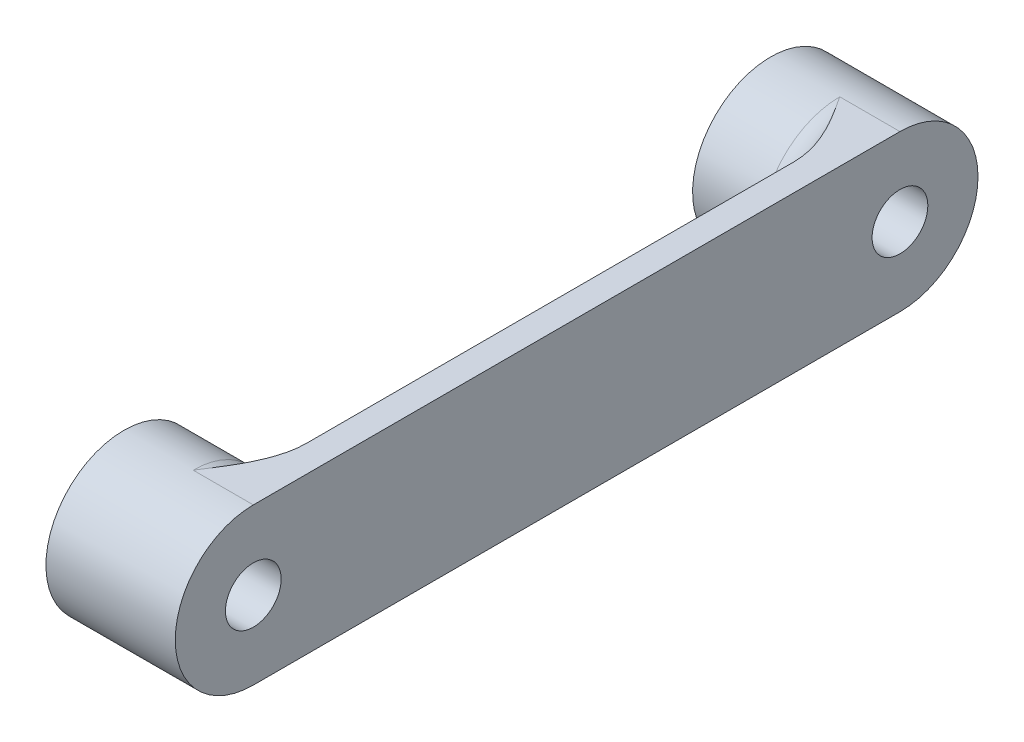
ISO-10303-21;
HEADER;
FILE_DESCRIPTION(('STEP AP214'),'2;1');
FILE_NAME('part.step','',(''),(''),'','','');
FILE_SCHEMA(('AUTOMOTIVE_DESIGN { 1 0 10303 214 1 1 1 1 }'));
ENDSEC;
DATA;
#1=APPLICATION_CONTEXT('core data for automotive mechanical design processes');
#2=APPLICATION_PROTOCOL_DEFINITION('international standard','automotive_design',2000,#1);
#3=PRODUCT_CONTEXT('',#1,'mechanical');
#4=PRODUCT('Part','Part','',(#3));
#5=PRODUCT_RELATED_PRODUCT_CATEGORY('part','',(#4));
#6=PRODUCT_DEFINITION_FORMATION('','',#4);
#7=PRODUCT_DEFINITION_CONTEXT('part definition',#1,'design');
#8=PRODUCT_DEFINITION('design','',#6,#7);
#9=PRODUCT_DEFINITION_SHAPE('','',#8);
#10=(LENGTH_UNIT() NAMED_UNIT(*) SI_UNIT(.MILLI.,.METRE.));
#11=(NAMED_UNIT(*) PLANE_ANGLE_UNIT() SI_UNIT($,.RADIAN.));
#12=(NAMED_UNIT(*) SI_UNIT($,.STERADIAN.) SOLID_ANGLE_UNIT());
#13=UNCERTAINTY_MEASURE_WITH_UNIT(LENGTH_MEASURE(1.E-05),#10,'distance_accuracy_value','');
#14=(GEOMETRIC_REPRESENTATION_CONTEXT(3) GLOBAL_UNCERTAINTY_ASSIGNED_CONTEXT((#13)) GLOBAL_UNIT_ASSIGNED_CONTEXT((#10,
#11,#12)) REPRESENTATION_CONTEXT('',''));
#15=CARTESIAN_POINT('',(0.,0.,0.));
#16=DIRECTION('',(0.,0.,1.));
#17=DIRECTION('',(1.,0.,0.));
#18=AXIS2_PLACEMENT_3D('',#15,#16,#17);
#19=CARTESIAN_POINT('',(9.2,0.,0.));
#20=DIRECTION('',(1.,0.,0.));
#21=DIRECTION('',(0.,0.,-1.));
#22=AXIS2_PLACEMENT_3D('',#19,#20,#21);
#23=PLANE('',#22);
#24=DIRECTION('',(0.,0.,1.));
#25=VECTOR('',#24,1.);
#26=CARTESIAN_POINT('',(9.2,-7.,0.));
#27=LINE('',#26,#25);
#28=CARTESIAN_POINT('',(9.2,-6.99999999999999,-21.8585715714571));
#29=VERTEX_POINT('',#28);
#30=CARTESIAN_POINT('',(9.2,-7.,21.8585715714572));
#31=VERTEX_POINT('',#30);
#32=EDGE_CURVE('E133',#29,#31,#27,.T.);
#33=ORIENTED_EDGE('',*,*,#32,.T.);
#34=CARTESIAN_POINT('',(9.2,0.,29.));
#35=DIRECTION('',(1.,0.,0.));
#36=DIRECTION('',(0.,0.,-1.));
#37=AXIS2_PLACEMENT_3D('',#34,#35,#36);
#38=CIRCLE('',#37,10.);
#39=CARTESIAN_POINT('',(9.2,7.,21.8585715714572));
#40=VERTEX_POINT('',#39);
#41=EDGE_CURVE('E151',#31,#40,#38,.T.);
#42=ORIENTED_EDGE('',*,*,#41,.T.);
#43=DIRECTION('',(0.,0.,-1.));
#44=VECTOR('',#43,1.);
#45=CARTESIAN_POINT('',(9.2,7.00000000000001,0.));
#46=LINE('',#45,#44);
#47=CARTESIAN_POINT('',(9.2,7.00000000000001,-21.8585715714571));
#48=VERTEX_POINT('',#47);
#49=EDGE_CURVE('E136',#40,#48,#46,.T.);
#50=ORIENTED_EDGE('',*,*,#49,.T.);
#51=CARTESIAN_POINT('',(9.2,0.,-29.));
#52=DIRECTION('',(1.,0.,0.));
#53=DIRECTION('',(0.,0.,-1.));
#54=AXIS2_PLACEMENT_3D('',#51,#52,#53);
#55=CIRCLE('',#54,10.);
#56=EDGE_CURVE('E148',#48,#29,#55,.T.);
#57=ORIENTED_EDGE('',*,*,#56,.T.);
#58=EDGE_LOOP('',(#33,#42,#50,#57));
#59=FACE_BOUND('',#58,.T.);
#60=ADVANCED_FACE('F41',(#59),#23,.F.);
#61=CARTESIAN_POINT('',(9.2,0.,29.));
#62=DIRECTION('',(-1.,0.,0.));
#63=DIRECTION('',(0.,0.,1.));
#64=AXIS2_PLACEMENT_3D('',#61,#62,#63);
#65=CYLINDRICAL_SURFACE('',#64,7.);
#66=DIRECTION('',(-1.,0.,0.));
#67=VECTOR('',#66,1.);
#68=CARTESIAN_POINT('',(11.6,7.,29.));
#69=LINE('',#68,#67);
#70=CARTESIAN_POINT('',(11.6,7.,29.));
#71=VERTEX_POINT('',#70);
#72=CARTESIAN_POINT('',(6.2,7.,29.));
#73=VERTEX_POINT('',#72);
#74=EDGE_CURVE('E132',#71,#73,#69,.T.);
#75=ORIENTED_EDGE('',*,*,#74,.T.);
#76=CARTESIAN_POINT('',(6.2,0.,29.));
#77=DIRECTION('',(1.,0.,0.));
#78=DIRECTION('',(0.,0.,-1.));
#79=AXIS2_PLACEMENT_3D('',#76,#77,#78);
#80=CIRCLE('',#79,7.);
#81=CARTESIAN_POINT('',(6.2,-7.,29.));
#82=VERTEX_POINT('',#81);
#83=EDGE_CURVE('E116',#73,#82,#80,.F.);
#84=ORIENTED_EDGE('',*,*,#83,.T.);
#85=DIRECTION('',(-1.,0.,0.));
#86=VECTOR('',#85,1.);
#87=CARTESIAN_POINT('',(11.6,-7.,29.));
#88=LINE('',#87,#86);
#89=CARTESIAN_POINT('',(11.6,-7.,29.));
#90=VERTEX_POINT('',#89);
#91=EDGE_CURVE('E112',#90,#82,#88,.T.);
#92=ORIENTED_EDGE('',*,*,#91,.F.);
#93=CARTESIAN_POINT('',(11.6,0.,29.));
#94=DIRECTION('',(1.,0.,0.));
#95=DIRECTION('',(0.,0.,-1.));
#96=AXIS2_PLACEMENT_3D('',#93,#94,#95);
#97=CIRCLE('',#96,7.);
#98=EDGE_CURVE('E101',#71,#90,#97,.T.);
#99=ORIENTED_EDGE('',*,*,#98,.F.);
#100=EDGE_LOOP('',(#75,#84,#92,#99));
#101=FACE_BOUND('',#100,.T.);
#102=CARTESIAN_POINT('',(0.,0.,29.));
#103=DIRECTION('',(1.,0.,0.));
#104=DIRECTION('',(0.,0.,-1.));
#105=AXIS2_PLACEMENT_3D('',#102,#103,#104);
#106=CIRCLE('',#105,7.);
#107=CARTESIAN_POINT('',(0.,0.,22.));
#108=VERTEX_POINT('',#107);
#109=EDGE_CURVE('E119',#108,#108,#106,.T.);
#110=ORIENTED_EDGE('',*,*,#109,.T.);
#111=EDGE_LOOP('',(#110));
#112=FACE_BOUND('',#111,.T.);
#113=ADVANCED_FACE('F113',(#101,#112),#65,.T.);
#114=CARTESIAN_POINT('',(9.2,0.,29.));
#115=DIRECTION('',(-1.,0.,0.));
#116=DIRECTION('',(0.,0.,1.));
#117=AXIS2_PLACEMENT_3D('',#114,#115,#116);
#118=CYLINDRICAL_SURFACE('',#117,2.5);
#119=CARTESIAN_POINT('',(0.,0.,29.));
#120=DIRECTION('',(1.,0.,0.));
#121=DIRECTION('',(0.,0.,-1.));
#122=AXIS2_PLACEMENT_3D('',#119,#120,#121);
#123=CIRCLE('',#122,2.5);
#124=CARTESIAN_POINT('',(0.,0.,26.5));
#125=VERTEX_POINT('',#124);
#126=EDGE_CURVE('E145',#125,#125,#123,.T.);
#127=ORIENTED_EDGE('',*,*,#126,.F.);
#128=EDGE_LOOP('',(#127));
#129=FACE_BOUND('',#128,.T.);
#130=CARTESIAN_POINT('',(11.6,0.,29.));
#131=DIRECTION('',(1.,0.,0.));
#132=DIRECTION('',(0.,0.,-1.));
#133=AXIS2_PLACEMENT_3D('',#130,#131,#132);
#134=CIRCLE('',#133,2.5);
#135=CARTESIAN_POINT('',(11.6,0.,26.5));
#136=VERTEX_POINT('',#135);
#137=EDGE_CURVE('E109',#136,#136,#134,.F.);
#138=ORIENTED_EDGE('',*,*,#137,.F.);
#139=EDGE_LOOP('',(#138));
#140=FACE_BOUND('',#139,.T.);
#141=ADVANCED_FACE('F213',(#129,#140),#118,.F.);
#142=CARTESIAN_POINT('',(0.,0.,0.));
#143=DIRECTION('',(1.,0.,0.));
#144=DIRECTION('',(0.,0.,-1.));
#145=AXIS2_PLACEMENT_3D('',#142,#143,#144);
#146=PLANE('',#145);
#147=ORIENTED_EDGE('',*,*,#109,.F.);
#148=EDGE_LOOP('',(#147));
#149=FACE_BOUND('',#148,.T.);
#150=ORIENTED_EDGE('',*,*,#126,.T.);
#151=EDGE_LOOP('',(#150));
#152=FACE_BOUND('',#151,.T.);
#153=ADVANCED_FACE('F186',(#149,#152),#146,.F.);
#154=CARTESIAN_POINT('',(11.6,-7.,0.));
#155=DIRECTION('',(0.,-1.,0.));
#156=DIRECTION('',(0.,0.,-1.));
#157=AXIS2_PLACEMENT_3D('',#154,#155,#156);
#158=PLANE('',#157);
#159=ORIENTED_EDGE('',*,*,#32,.F.);
#160=CARTESIAN_POINT('',(9.2,-6.99999999999999,-21.8585715714571));
#161=CARTESIAN_POINT('',(9.19997036123038,-6.99999999999999,-22.0531749853393));
#162=CARTESIAN_POINT('',(9.19035081099013,-6.99999999999999,-22.2475199203834));
#163=CARTESIAN_POINT('',(9.15412383951473,-6.99999999999999,-22.6342535677378));
#164=CARTESIAN_POINT('',(9.1275508180066,-6.99999999999999,-22.826645441705));
#165=CARTESIAN_POINT('',(9.02676772226861,-6.99999999999999,-23.3934189687769));
#166=CARTESIAN_POINT('',(8.93133692765782,-6.99999999999999,-23.7640763402872));
#167=CARTESIAN_POINT('',(8.74438409845272,-6.99999999999999,-24.3456949499449));
#168=CARTESIAN_POINT('',(8.66650125204236,-6.99999999999999,-24.5613544187696));
#169=CARTESIAN_POINT('',(8.49787045806467,-6.99999999999999,-24.987614754906));
#170=CARTESIAN_POINT('',(8.40712202025387,-6.99999999999999,-25.1982154290946));
#171=CARTESIAN_POINT('',(8.11891858762392,-6.99999999999999,-25.8232915918653));
#172=CARTESIAN_POINT('',(7.90570861502967,-6.99999999999999,-26.2304513192238));
#173=CARTESIAN_POINT('',(7.45164940245449,-6.99999999999999,-27.0332582574389));
#174=CARTESIAN_POINT('',(7.21057309170736,-6.99999999999999,-27.428772349044));
#175=CARTESIAN_POINT('',(6.71606727910991,-6.99999999999999,-28.2115416173697));
#176=CARTESIAN_POINT('',(6.46264494546801,-6.99999999999999,-28.5988014031886));
#177=CARTESIAN_POINT('',(6.20611009853835,-6.99999999999999,-28.9906666685835));
#178=CARTESIAN_POINT('',(6.20305504803098,-6.99999999999999,-28.9953333352776));
#179=CARTESIAN_POINT('',(6.2,-6.99999999999999,-29.));
#180=B_SPLINE_CURVE_WITH_KNOTS('',3,(#160,#161,#162,#163,#164,#165,#166,#167,#168,#169,#170,
#171,#172,#173,#174,#175,#176,#177,#178,#179),.UNSPECIFIED.,.F.,.F.,(4,2,2,2,2,2,2,2,2,4),(0.,
0.583173013827294,1.16516647772116,2.30934960332323,2.99690697655282,3.68449055620677,
5.0615191781584,6.45068618861692,7.83905603192579,7.85578923245647),.UNSPECIFIED.);
#181=CARTESIAN_POINT('',(6.2,-6.99999999999999,-29.));
#182=VERTEX_POINT('',#181);
#183=EDGE_CURVE('E55',#29,#182,#180,.T.);
#184=ORIENTED_EDGE('',*,*,#183,.T.);
#185=DIRECTION('',(-1.,0.,0.));
#186=VECTOR('',#185,1.);
#187=CARTESIAN_POINT('',(11.6,-6.99999999999999,-29.));
#188=LINE('',#187,#186);
#189=CARTESIAN_POINT('',(11.6,-6.99999999999999,-29.));
#190=VERTEX_POINT('',#189);
#191=EDGE_CURVE('E62',#190,#182,#188,.T.);
#192=ORIENTED_EDGE('',*,*,#191,.F.);
#193=DIRECTION('',(0.,0.,1.));
#194=VECTOR('',#193,1.);
#195=CARTESIAN_POINT('',(11.6,-7.,0.));
#196=LINE('',#195,#194);
#197=EDGE_CURVE('E106',#190,#90,#196,.T.);
#198=ORIENTED_EDGE('',*,*,#197,.T.);
#199=ORIENTED_EDGE('',*,*,#91,.T.);
#200=CARTESIAN_POINT('',(9.2,-7.,21.8585715714572));
#201=CARTESIAN_POINT('',(9.19997036123038,-7.,22.0531749853392));
#202=CARTESIAN_POINT('',(9.19035081099014,-7.,22.2475199203833));
#203=CARTESIAN_POINT('',(9.15412383951476,-7.,22.6342535677376));
#204=CARTESIAN_POINT('',(9.12755081800665,-7.,22.8266454417046));
#205=CARTESIAN_POINT('',(9.02676772226868,-7.,23.3934189687766));
#206=CARTESIAN_POINT('',(8.93133692765786,-7.,23.764076340287));
#207=CARTESIAN_POINT('',(8.74438409845271,-7.,24.3456949499449));
#208=CARTESIAN_POINT('',(8.66650125204236,-7.,24.5613544187696));
#209=CARTESIAN_POINT('',(8.49787045806466,-7.,24.9876147549061));
#210=CARTESIAN_POINT('',(8.40712202025384,-7.,25.1982154290946));
#211=CARTESIAN_POINT('',(8.11891858762388,-7.,25.8232915918654));
#212=CARTESIAN_POINT('',(7.9057086150297,-7.,26.230451319224));
#213=CARTESIAN_POINT('',(7.45164940245423,-7.,27.033258257439));
#214=CARTESIAN_POINT('',(7.21057309170676,-7.,27.4287723490439));
#215=CARTESIAN_POINT('',(6.71606727911035,-7.,28.2115416173701));
#216=CARTESIAN_POINT('',(6.46264494546985,-7.,28.5988014031899));
#217=CARTESIAN_POINT('',(6.2061100985384,-7.,28.9906666685836));
#218=CARTESIAN_POINT('',(6.203055048031,-7.,28.9953333352776));
#219=CARTESIAN_POINT('',(6.2,-7.,29.));
#220=B_SPLINE_CURVE_WITH_KNOTS('',3,(#200,#201,#202,#203,#204,#205,#206,#207,#208,#209,#210,
#211,#212,#213,#214,#215,#216,#217,#218,#219),.UNSPECIFIED.,.F.,.F.,(4,2,2,2,2,2,2,2,2,4),(0.,
0.583173013827082,1.16516647772078,2.30934960332323,2.99690697655284,3.68449055620683,
5.06151917815867,6.45068618861708,7.83905603192576,7.85578923245647),.UNSPECIFIED.);
#221=EDGE_CURVE('E164',#82,#31,#220,.F.);
#222=ORIENTED_EDGE('',*,*,#221,.T.);
#223=EDGE_LOOP('',(#159,#184,#192,#198,#199,#222));
#224=FACE_BOUND('',#223,.T.);
#225=ADVANCED_FACE('F122',(#224),#158,.T.);
#226=CARTESIAN_POINT('',(11.6,0.,-29.));
#227=DIRECTION('',(-1.,0.,0.));
#228=DIRECTION('',(0.,0.,1.));
#229=AXIS2_PLACEMENT_3D('',#226,#227,#228);
#230=CYLINDRICAL_SURFACE('',#229,7.);
#231=ORIENTED_EDGE('',*,*,#191,.T.);
#232=CARTESIAN_POINT('',(6.2,0.,-29.));
#233=DIRECTION('',(1.,0.,0.));
#234=DIRECTION('',(0.,0.,-1.));
#235=AXIS2_PLACEMENT_3D('',#232,#233,#234);
#236=CIRCLE('',#235,7.);
#237=CARTESIAN_POINT('',(6.2,7.00000000000001,-29.));
#238=VERTEX_POINT('',#237);
#239=EDGE_CURVE('E155',#182,#238,#236,.F.);
#240=ORIENTED_EDGE('',*,*,#239,.T.);
#241=DIRECTION('',(-1.,0.,0.));
#242=VECTOR('',#241,1.);
#243=CARTESIAN_POINT('',(11.6,7.00000000000001,-29.));
#244=LINE('',#243,#242);
#245=CARTESIAN_POINT('',(11.6,7.00000000000001,-29.));
#246=VERTEX_POINT('',#245);
#247=EDGE_CURVE('E69',#246,#238,#244,.T.);
#248=ORIENTED_EDGE('',*,*,#247,.F.);
#249=CARTESIAN_POINT('',(11.6,0.,-29.));
#250=DIRECTION('',(1.,0.,0.));
#251=DIRECTION('',(0.,0.,-1.));
#252=AXIS2_PLACEMENT_3D('',#249,#250,#251);
#253=CIRCLE('',#252,7.);
#254=EDGE_CURVE('E123',#190,#246,#253,.T.);
#255=ORIENTED_EDGE('',*,*,#254,.F.);
#256=EDGE_LOOP('',(#231,#240,#248,#255));
#257=FACE_BOUND('',#256,.T.);
#258=CARTESIAN_POINT('',(0.,0.,-29.));
#259=DIRECTION('',(1.,0.,0.));
#260=DIRECTION('',(0.,0.,-1.));
#261=AXIS2_PLACEMENT_3D('',#258,#259,#260);
#262=CIRCLE('',#261,7.);
#263=CARTESIAN_POINT('',(0.,0.,-36.));
#264=VERTEX_POINT('',#263);
#265=EDGE_CURVE('E137',#264,#264,#262,.T.);
#266=ORIENTED_EDGE('',*,*,#265,.T.);
#267=EDGE_LOOP('',(#266));
#268=FACE_BOUND('',#267,.T.);
#269=ADVANCED_FACE('F179',(#257,#268),#230,.T.);
#270=CARTESIAN_POINT('',(11.6,7.00000000000001,0.));
#271=DIRECTION('',(0.,1.,0.));
#272=DIRECTION('',(0.,0.,1.));
#273=AXIS2_PLACEMENT_3D('',#270,#271,#272);
#274=PLANE('',#273);
#275=ORIENTED_EDGE('',*,*,#49,.F.);
#276=CARTESIAN_POINT('',(9.2,7.,21.8585715714572));
#277=CARTESIAN_POINT('',(9.19997036123038,7.,22.0531749853392));
#278=CARTESIAN_POINT('',(9.19035081099014,7.,22.2475199203833));
#279=CARTESIAN_POINT('',(9.15412383951475,7.,22.6342535677376));
#280=CARTESIAN_POINT('',(9.12755081800664,7.,22.8266454417047));
#281=CARTESIAN_POINT('',(9.02676772226867,7.,23.3934189687767));
#282=CARTESIAN_POINT('',(8.93133692765785,7.,23.7640763402871));
#283=CARTESIAN_POINT('',(8.74438409845271,7.,24.3456949499449));
#284=CARTESIAN_POINT('',(8.66650125204236,7.,24.5613544187696));
#285=CARTESIAN_POINT('',(8.49787045806466,7.,24.9876147549061));
#286=CARTESIAN_POINT('',(8.40712202025385,7.,25.1982154290946));
#287=CARTESIAN_POINT('',(8.11891858762389,7.,25.8232915918654));
#288=CARTESIAN_POINT('',(7.9057086150297,7.,26.230451319224));
#289=CARTESIAN_POINT('',(7.45164940245427,7.,27.033258257439));
#290=CARTESIAN_POINT('',(7.21057309170686,7.,27.4287723490439));
#291=CARTESIAN_POINT('',(6.71606727911028,7.,28.21154161737));
#292=CARTESIAN_POINT('',(6.46264494546955,7.,28.5988014031897));
#293=CARTESIAN_POINT('',(6.20611009853839,7.,28.9906666685836));
#294=CARTESIAN_POINT('',(6.203055048031,7.,28.9953333352776));
#295=CARTESIAN_POINT('',(6.2,7.,29.));
#296=B_SPLINE_CURVE_WITH_KNOTS('',3,(#276,#277,#278,#279,#280,#281,#282,#283,#284,#285,#286,
#287,#288,#289,#290,#291,#292,#293,#294,#295),.UNSPECIFIED.,.F.,.F.,(4,2,2,2,2,2,2,2,2,4),(0.,
0.583173013827117,1.16516647772084,2.30934960332323,2.99690697655284,3.68449055620682,
5.06151917815863,6.45068618861706,7.83905603192576,7.85578923245647),.UNSPECIFIED.);
#297=EDGE_CURVE('E157',#40,#73,#296,.T.);
#298=ORIENTED_EDGE('',*,*,#297,.T.);
#299=ORIENTED_EDGE('',*,*,#74,.F.);
#300=DIRECTION('',(0.,0.,-1.));
#301=VECTOR('',#300,1.);
#302=CARTESIAN_POINT('',(11.6,7.00000000000001,0.));
#303=LINE('',#302,#301);
#304=EDGE_CURVE('E107',#71,#246,#303,.T.);
#305=ORIENTED_EDGE('',*,*,#304,.T.);
#306=ORIENTED_EDGE('',*,*,#247,.T.);
#307=CARTESIAN_POINT('',(9.2,7.00000000000001,-21.8585715714571));
#308=CARTESIAN_POINT('',(9.19997036123038,7.00000000000001,-22.0531749853392));
#309=CARTESIAN_POINT('',(9.19035081099014,7.00000000000001,-22.2475199203832));
#310=CARTESIAN_POINT('',(9.15412383951477,7.00000000000001,-22.6342535677374));
#311=CARTESIAN_POINT('',(9.12755081800667,7.00000000000001,-22.8266454417045));
#312=CARTESIAN_POINT('',(9.0267677222687,7.00000000000001,-23.3934189687765));
#313=CARTESIAN_POINT('',(8.93133692765787,7.00000000000001,-23.764076340287));
#314=CARTESIAN_POINT('',(8.74438409845271,7.00000000000001,-24.3456949499449));
#315=CARTESIAN_POINT('',(8.66650125204236,7.00000000000001,-24.5613544187696));
#316=CARTESIAN_POINT('',(8.49787045806465,7.00000000000001,-24.9876147549061));
#317=CARTESIAN_POINT('',(8.40712202025383,7.00000000000001,-25.1982154290946));
#318=CARTESIAN_POINT('',(8.11891858762387,7.00000000000001,-25.8232915918655));
#319=CARTESIAN_POINT('',(7.90570861502972,7.00000000000001,-26.2304513192241));
#320=CARTESIAN_POINT('',(7.45164940245413,7.00000000000001,-27.0332582574391));
#321=CARTESIAN_POINT('',(7.2105730917065,7.00000000000001,-27.4287723490438));
#322=CARTESIAN_POINT('',(6.71606727911054,7.00000000000001,-28.2115416173703));
#323=CARTESIAN_POINT('',(6.46264494547062,7.00000000000001,-28.5988014031904));
#324=CARTESIAN_POINT('',(6.20611009853842,7.00000000000001,-28.9906666685836));
#325=CARTESIAN_POINT('',(6.20305504803101,7.00000000000001,-28.9953333352776));
#326=CARTESIAN_POINT('',(6.2,7.00000000000001,-29.));
#327=B_SPLINE_CURVE_WITH_KNOTS('',3,(#307,#308,#309,#310,#311,#312,#313,#314,#315,#316,#317,
#318,#319,#320,#321,#322,#323,#324,#325,#326),.UNSPECIFIED.,.F.,.F.,(4,2,2,2,2,2,2,2,2,4),(0.,
0.583173013826991,1.16516647772063,2.30934960332323,2.99690697655285,3.68449055620686,
5.06151917815879,6.45068618861715,7.83905603192575,7.85578923245647),.UNSPECIFIED.);
#328=EDGE_CURVE('E11',#238,#48,#327,.F.);
#329=ORIENTED_EDGE('',*,*,#328,.T.);
#330=EDGE_LOOP('',(#275,#298,#299,#305,#306,#329));
#331=FACE_BOUND('',#330,.T.);
#332=ADVANCED_FACE('F173',(#331),#274,.T.);
#333=CARTESIAN_POINT('',(11.6,0.,-29.));
#334=DIRECTION('',(-1.,0.,0.));
#335=DIRECTION('',(0.,0.,1.));
#336=AXIS2_PLACEMENT_3D('',#333,#334,#335);
#337=CYLINDRICAL_SURFACE('',#336,2.5);
#338=CARTESIAN_POINT('',(11.6,0.,-29.));
#339=DIRECTION('',(1.,0.,0.));
#340=DIRECTION('',(0.,0.,-1.));
#341=AXIS2_PLACEMENT_3D('',#338,#339,#340);
#342=CIRCLE('',#341,2.5);
#343=CARTESIAN_POINT('',(11.6,0.,-31.5));
#344=VERTEX_POINT('',#343);
#345=EDGE_CURVE('E129',#344,#344,#342,.T.);
#346=ORIENTED_EDGE('',*,*,#345,.T.);
#347=EDGE_LOOP('',(#346));
#348=FACE_BOUND('',#347,.T.);
#349=CARTESIAN_POINT('',(0.,0.,-29.));
#350=DIRECTION('',(1.,0.,0.));
#351=DIRECTION('',(0.,0.,-1.));
#352=AXIS2_PLACEMENT_3D('',#349,#350,#351);
#353=CIRCLE('',#352,2.5);
#354=CARTESIAN_POINT('',(0.,0.,-31.5));
#355=VERTEX_POINT('',#354);
#356=EDGE_CURVE('E205',#355,#355,#353,.T.);
#357=ORIENTED_EDGE('',*,*,#356,.F.);
#358=EDGE_LOOP('',(#357));
#359=FACE_BOUND('',#358,.T.);
#360=ADVANCED_FACE('F178',(#348,#359),#337,.F.);
#361=CARTESIAN_POINT('',(11.6,0.,0.));
#362=DIRECTION('',(1.,0.,0.));
#363=DIRECTION('',(0.,0.,-1.));
#364=AXIS2_PLACEMENT_3D('',#361,#362,#363);
#365=PLANE('',#364);
#366=ORIENTED_EDGE('',*,*,#137,.T.);
#367=EDGE_LOOP('',(#366));
#368=FACE_BOUND('',#367,.T.);
#369=ORIENTED_EDGE('',*,*,#98,.T.);
#370=ORIENTED_EDGE('',*,*,#197,.F.);
#371=ORIENTED_EDGE('',*,*,#254,.T.);
#372=ORIENTED_EDGE('',*,*,#304,.F.);
#373=EDGE_LOOP('',(#369,#370,#371,#372));
#374=FACE_BOUND('',#373,.T.);
#375=ORIENTED_EDGE('',*,*,#345,.F.);
#376=EDGE_LOOP('',(#375));
#377=FACE_BOUND('',#376,.T.);
#378=ADVANCED_FACE('F103',(#368,#374,#377),#365,.T.);
#379=CARTESIAN_POINT('',(0.,0.,0.));
#380=DIRECTION('',(1.,0.,0.));
#381=DIRECTION('',(0.,0.,-1.));
#382=AXIS2_PLACEMENT_3D('',#379,#380,#381);
#383=PLANE('',#382);
#384=ORIENTED_EDGE('',*,*,#356,.T.);
#385=EDGE_LOOP('',(#384));
#386=FACE_BOUND('',#385,.T.);
#387=ORIENTED_EDGE('',*,*,#265,.F.);
#388=EDGE_LOOP('',(#387));
#389=FACE_BOUND('',#388,.T.);
#390=ADVANCED_FACE('F230',(#386,#389),#383,.F.);
#391=CARTESIAN_POINT('',(6.2,0.,29.));
#392=DIRECTION('',(1.,0.,0.));
#393=DIRECTION('',(0.,0.,-1.));
#394=AXIS2_PLACEMENT_3D('',#391,#392,#393);
#395=TOROIDAL_SURFACE('',#394,10.,3.);
#396=ORIENTED_EDGE('',*,*,#221,.F.);
#397=ORIENTED_EDGE('',*,*,#83,.F.);
#398=ORIENTED_EDGE('',*,*,#297,.F.);
#399=ORIENTED_EDGE('',*,*,#41,.F.);
#400=EDGE_LOOP('',(#396,#397,#398,#399));
#401=FACE_BOUND('',#400,.T.);
#402=ADVANCED_FACE('F170',(#401),#395,.F.);
#403=CARTESIAN_POINT('',(6.2,0.,-29.));
#404=DIRECTION('',(1.,0.,0.));
#405=DIRECTION('',(0.,0.,-1.));
#406=AXIS2_PLACEMENT_3D('',#403,#404,#405);
#407=TOROIDAL_SURFACE('',#406,10.,3.);
#408=ORIENTED_EDGE('',*,*,#328,.F.);
#409=ORIENTED_EDGE('',*,*,#239,.F.);
#410=ORIENTED_EDGE('',*,*,#183,.F.);
#411=ORIENTED_EDGE('',*,*,#56,.F.);
#412=EDGE_LOOP('',(#408,#409,#410,#411));
#413=FACE_BOUND('',#412,.T.);
#414=ADVANCED_FACE('F43',(#413),#407,.F.);
#415=CLOSED_SHELL('',(#60,#113,#141,#153,#225,#269,#332,#360,#378,#390,#402,#414));
#416=MANIFOLD_SOLID_BREP('B2',#415);
#417=ADVANCED_BREP_SHAPE_REPRESENTATION('',(#18,#416),#14);
#418=SHAPE_DEFINITION_REPRESENTATION(#9,#417);
ENDSEC;
END-ISO-10303-21;
